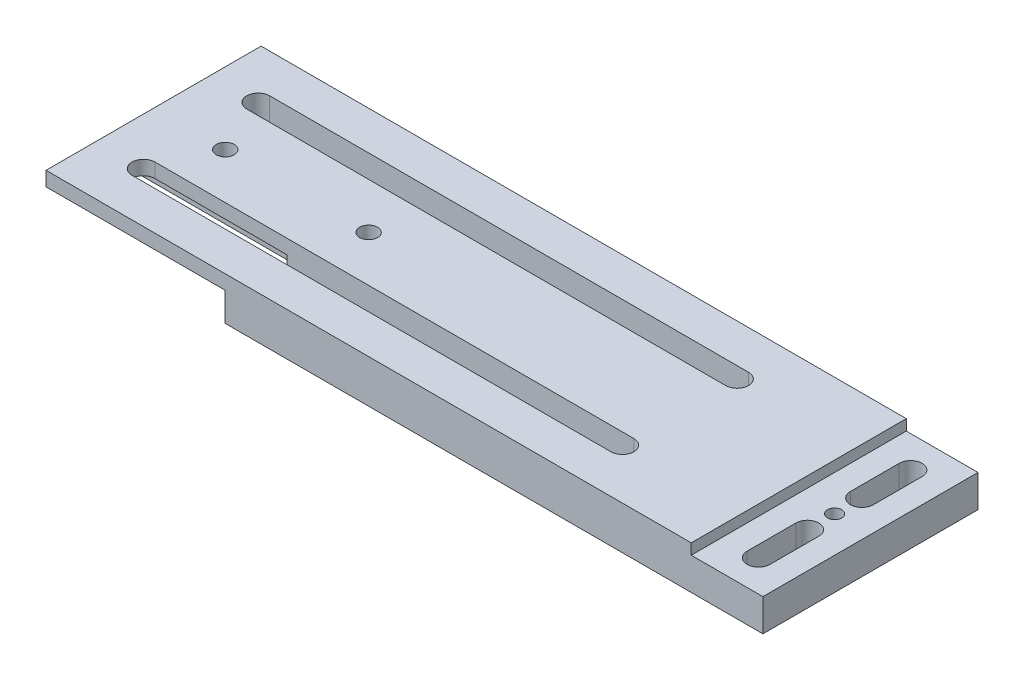
ISO-10303-21;
HEADER;
FILE_DESCRIPTION(('STEP AP214'),'2;1');
FILE_NAME('part.step','',(''),(''),'','','');
FILE_SCHEMA(('AUTOMOTIVE_DESIGN { 1 0 10303 214 1 1 1 1 }'));
ENDSEC;
DATA;
#1=APPLICATION_CONTEXT('core data for automotive mechanical design processes');
#2=APPLICATION_PROTOCOL_DEFINITION('international standard','automotive_design',2000,#1);
#3=PRODUCT_CONTEXT('',#1,'mechanical');
#4=PRODUCT('Part','Part','',(#3));
#5=PRODUCT_RELATED_PRODUCT_CATEGORY('part','',(#4));
#6=PRODUCT_DEFINITION_FORMATION('','',#4);
#7=PRODUCT_DEFINITION_CONTEXT('part definition',#1,'design');
#8=PRODUCT_DEFINITION('design','',#6,#7);
#9=PRODUCT_DEFINITION_SHAPE('','',#8);
#10=(LENGTH_UNIT() NAMED_UNIT(*) SI_UNIT(.MILLI.,.METRE.));
#11=(NAMED_UNIT(*) PLANE_ANGLE_UNIT() SI_UNIT($,.RADIAN.));
#12=(NAMED_UNIT(*) SI_UNIT($,.STERADIAN.) SOLID_ANGLE_UNIT());
#13=UNCERTAINTY_MEASURE_WITH_UNIT(LENGTH_MEASURE(1.E-05),#10,'distance_accuracy_value','');
#14=(GEOMETRIC_REPRESENTATION_CONTEXT(3) GLOBAL_UNCERTAINTY_ASSIGNED_CONTEXT((#13)) GLOBAL_UNIT_ASSIGNED_CONTEXT((#10,
#11,#12)) REPRESENTATION_CONTEXT('',''));
#15=CARTESIAN_POINT('',(0.,0.,0.));
#16=DIRECTION('',(0.,0.,1.));
#17=DIRECTION('',(1.,0.,0.));
#18=AXIS2_PLACEMENT_3D('',#15,#16,#17);
#19=CARTESIAN_POINT('',(50.,6.,-15.));
#20=DIRECTION('',(-1.,0.,0.));
#21=DIRECTION('',(0.,0.,1.));
#22=AXIS2_PLACEMENT_3D('',#19,#20,#21);
#23=PLANE('',#22);
#24=DIRECTION('',(0.,0.,-1.));
#25=VECTOR('',#24,1.);
#26=CARTESIAN_POINT('',(50.,4.5,15.));
#27=LINE('',#26,#25);
#28=CARTESIAN_POINT('',(50.,4.5,15.));
#29=VERTEX_POINT('',#28);
#30=CARTESIAN_POINT('',(50.,4.5,-15.));
#31=VERTEX_POINT('',#30);
#32=EDGE_CURVE('E345',#29,#31,#27,.T.);
#33=ORIENTED_EDGE('',*,*,#32,.F.);
#34=DIRECTION('',(0.,-1.,0.));
#35=VECTOR('',#34,1.);
#36=CARTESIAN_POINT('',(50.,6.,15.));
#37=LINE('',#36,#35);
#38=CARTESIAN_POINT('',(50.,0.,15.));
#39=VERTEX_POINT('',#38);
#40=EDGE_CURVE('E717',#29,#39,#37,.T.);
#41=ORIENTED_EDGE('',*,*,#40,.T.);
#42=DIRECTION('',(0.,0.,-1.));
#43=VECTOR('',#42,1.);
#44=CARTESIAN_POINT('',(50.,0.,-15.));
#45=LINE('',#44,#43);
#46=CARTESIAN_POINT('',(50.,0.,-15.));
#47=VERTEX_POINT('',#46);
#48=EDGE_CURVE('E709',#39,#47,#45,.T.);
#49=ORIENTED_EDGE('',*,*,#48,.T.);
#50=DIRECTION('',(0.,-1.,0.));
#51=VECTOR('',#50,1.);
#52=CARTESIAN_POINT('',(50.,6.,-15.));
#53=LINE('',#52,#51);
#54=EDGE_CURVE('E715',#31,#47,#53,.T.);
#55=ORIENTED_EDGE('',*,*,#54,.F.);
#56=EDGE_LOOP('',(#33,#41,#49,#55));
#57=FACE_BOUND('',#56,.T.);
#58=ADVANCED_FACE('F330',(#57),#23,.F.);
#59=CARTESIAN_POINT('',(45.,0.,-10.6050627929627));
#60=DIRECTION('',(0.,-1.,0.));
#61=DIRECTION('',(0.,0.,-1.));
#62=AXIS2_PLACEMENT_3D('',#59,#60,#61);
#63=CYLINDRICAL_SURFACE('',#62,1.6);
#64=CARTESIAN_POINT('',(45.,4.5,-10.6050627929627));
#65=DIRECTION('',(0.,1.,0.));
#66=DIRECTION('',(0.,0.,1.));
#67=AXIS2_PLACEMENT_3D('',#64,#65,#66);
#68=CIRCLE('',#67,1.6);
#69=CARTESIAN_POINT('',(43.4,4.5,-10.6050627929627));
#70=VERTEX_POINT('',#69);
#71=CARTESIAN_POINT('',(46.6,4.5,-10.6050627929627));
#72=VERTEX_POINT('',#71);
#73=EDGE_CURVE('E548',#70,#72,#68,.F.);
#74=ORIENTED_EDGE('',*,*,#73,.F.);
#75=DIRECTION('',(0.,-1.,0.));
#76=VECTOR('',#75,1.);
#77=CARTESIAN_POINT('',(43.4,0.,-10.6050627929627));
#78=LINE('',#77,#76);
#79=CARTESIAN_POINT('',(43.4,0.,-10.6050627929627));
#80=VERTEX_POINT('',#79);
#81=EDGE_CURVE('E633',#80,#70,#78,.F.);
#82=ORIENTED_EDGE('',*,*,#81,.F.);
#83=CARTESIAN_POINT('',(45.,0.,-10.6050627929627));
#84=DIRECTION('',(0.,-1.,0.));
#85=DIRECTION('',(0.,0.,-1.));
#86=AXIS2_PLACEMENT_3D('',#83,#84,#85);
#87=CIRCLE('',#86,1.6);
#88=CARTESIAN_POINT('',(46.6,0.,-10.6050627929627));
#89=VERTEX_POINT('',#88);
#90=EDGE_CURVE('E631',#80,#89,#87,.T.);
#91=ORIENTED_EDGE('',*,*,#90,.T.);
#92=DIRECTION('',(0.,1.,0.));
#93=VECTOR('',#92,1.);
#94=CARTESIAN_POINT('',(46.6,8.5,-10.6050627929627));
#95=LINE('',#94,#93);
#96=EDGE_CURVE('E628',#89,#72,#95,.T.);
#97=ORIENTED_EDGE('',*,*,#96,.T.);
#98=EDGE_LOOP('',(#74,#82,#91,#97));
#99=FACE_BOUND('',#98,.T.);
#100=ADVANCED_FACE('F841',(#99),#63,.F.);
#101=CARTESIAN_POINT('',(45.,0.,-3.80506279296271));
#102=DIRECTION('',(0.,-1.,0.));
#103=DIRECTION('',(0.,0.,-1.));
#104=AXIS2_PLACEMENT_3D('',#101,#102,#103);
#105=CYLINDRICAL_SURFACE('',#104,1.6);
#106=CARTESIAN_POINT('',(45.,4.5,-3.80506279296271));
#107=DIRECTION('',(0.,1.,0.));
#108=DIRECTION('',(0.,0.,1.));
#109=AXIS2_PLACEMENT_3D('',#106,#107,#108);
#110=CIRCLE('',#109,1.6);
#111=CARTESIAN_POINT('',(46.6,4.5,-3.80506279296271));
#112=VERTEX_POINT('',#111);
#113=CARTESIAN_POINT('',(43.4,4.5,-3.80506279296271));
#114=VERTEX_POINT('',#113);
#115=EDGE_CURVE('E353',#112,#114,#110,.F.);
#116=ORIENTED_EDGE('',*,*,#115,.F.);
#117=DIRECTION('',(0.,1.,0.));
#118=VECTOR('',#117,1.);
#119=CARTESIAN_POINT('',(46.6,8.5,-3.80506279296271));
#120=LINE('',#119,#118);
#121=CARTESIAN_POINT('',(46.6,0.,-3.80506279296271));
#122=VERTEX_POINT('',#121);
#123=EDGE_CURVE('E620',#122,#112,#120,.T.);
#124=ORIENTED_EDGE('',*,*,#123,.F.);
#125=CARTESIAN_POINT('',(45.,0.,-3.80506279296271));
#126=DIRECTION('',(0.,-1.,0.));
#127=DIRECTION('',(0.,0.,-1.));
#128=AXIS2_PLACEMENT_3D('',#125,#126,#127);
#129=CIRCLE('',#128,1.6);
#130=CARTESIAN_POINT('',(43.4,0.,-3.80506279296271));
#131=VERTEX_POINT('',#130);
#132=EDGE_CURVE('E623',#122,#131,#129,.T.);
#133=ORIENTED_EDGE('',*,*,#132,.T.);
#134=DIRECTION('',(0.,-1.,0.));
#135=VECTOR('',#134,1.);
#136=CARTESIAN_POINT('',(43.4,0.,-3.80506279296271));
#137=LINE('',#136,#135);
#138=EDGE_CURVE('E626',#114,#131,#137,.T.);
#139=ORIENTED_EDGE('',*,*,#138,.F.);
#140=EDGE_LOOP('',(#116,#124,#133,#139));
#141=FACE_BOUND('',#140,.T.);
#142=ADVANCED_FACE('F846',(#141),#105,.F.);
#143=CARTESIAN_POINT('',(46.6,8.5,-3.80506279296271));
#144=DIRECTION('',(-1.,0.,0.));
#145=DIRECTION('',(0.,-1.,0.));
#146=AXIS2_PLACEMENT_3D('',#143,#144,#145);
#147=PLANE('',#146);
#148=ORIENTED_EDGE('',*,*,#123,.T.);
#149=DIRECTION('',(0.,0.,-1.));
#150=VECTOR('',#149,1.);
#151=CARTESIAN_POINT('',(46.6,4.5,-3.80506279296271));
#152=LINE('',#151,#150);
#153=EDGE_CURVE('E550',#112,#72,#152,.T.);
#154=ORIENTED_EDGE('',*,*,#153,.T.);
#155=ORIENTED_EDGE('',*,*,#96,.F.);
#156=DIRECTION('',(0.,0.,-1.));
#157=VECTOR('',#156,1.);
#158=CARTESIAN_POINT('',(46.6,0.,-3.80506279296271));
#159=LINE('',#158,#157);
#160=EDGE_CURVE('E617',#122,#89,#159,.T.);
#161=ORIENTED_EDGE('',*,*,#160,.F.);
#162=EDGE_LOOP('',(#148,#154,#155,#161));
#163=FACE_BOUND('',#162,.T.);
#164=ADVANCED_FACE('F891',(#163),#147,.T.);
#165=CARTESIAN_POINT('',(43.4,0.,-3.80506279296271));
#166=DIRECTION('',(-1.,0.,0.));
#167=DIRECTION('',(0.,0.,1.));
#168=AXIS2_PLACEMENT_3D('',#165,#166,#167);
#169=PLANE('',#168);
#170=DIRECTION('',(0.,0.,-1.));
#171=VECTOR('',#170,1.);
#172=CARTESIAN_POINT('',(43.4,4.5,-3.80506279296271));
#173=LINE('',#172,#171);
#174=EDGE_CURVE('E545',#114,#70,#173,.T.);
#175=ORIENTED_EDGE('',*,*,#174,.F.);
#176=ORIENTED_EDGE('',*,*,#138,.T.);
#177=DIRECTION('',(0.,0.,-1.));
#178=VECTOR('',#177,1.);
#179=CARTESIAN_POINT('',(43.4,0.,-3.80506279296271));
#180=LINE('',#179,#178);
#181=EDGE_CURVE('E615',#131,#80,#180,.T.);
#182=ORIENTED_EDGE('',*,*,#181,.T.);
#183=ORIENTED_EDGE('',*,*,#81,.T.);
#184=EDGE_LOOP('',(#175,#176,#182,#183));
#185=FACE_BOUND('',#184,.T.);
#186=ADVANCED_FACE('F895',(#185),#169,.F.);
#187=CARTESIAN_POINT('',(45.,0.,3.80506279296273));
#188=DIRECTION('',(0.,-1.,0.));
#189=DIRECTION('',(0.,0.,-1.));
#190=AXIS2_PLACEMENT_3D('',#187,#188,#189);
#191=CYLINDRICAL_SURFACE('',#190,1.6);
#192=CARTESIAN_POINT('',(45.,4.5,3.80506279296273));
#193=DIRECTION('',(0.,1.,0.));
#194=DIRECTION('',(0.,0.,1.));
#195=AXIS2_PLACEMENT_3D('',#192,#193,#194);
#196=CIRCLE('',#195,1.6);
#197=CARTESIAN_POINT('',(43.4,4.5,3.80506279296273));
#198=VERTEX_POINT('',#197);
#199=CARTESIAN_POINT('',(46.6,4.5,3.80506279296273));
#200=VERTEX_POINT('',#199);
#201=EDGE_CURVE('E540',#198,#200,#196,.F.);
#202=ORIENTED_EDGE('',*,*,#201,.F.);
#203=DIRECTION('',(0.,-1.,0.));
#204=VECTOR('',#203,1.);
#205=CARTESIAN_POINT('',(43.4,0.,3.80506279296273));
#206=LINE('',#205,#204);
#207=CARTESIAN_POINT('',(43.4,0.,3.80506279296273));
#208=VERTEX_POINT('',#207);
#209=EDGE_CURVE('E612',#208,#198,#206,.F.);
#210=ORIENTED_EDGE('',*,*,#209,.F.);
#211=CARTESIAN_POINT('',(45.,0.,3.80506279296273));
#212=DIRECTION('',(0.,-1.,0.));
#213=DIRECTION('',(0.,0.,-1.));
#214=AXIS2_PLACEMENT_3D('',#211,#212,#213);
#215=CIRCLE('',#214,1.6);
#216=CARTESIAN_POINT('',(46.6,0.,3.80506279296273));
#217=VERTEX_POINT('',#216);
#218=EDGE_CURVE('E610',#208,#217,#215,.T.);
#219=ORIENTED_EDGE('',*,*,#218,.T.);
#220=DIRECTION('',(0.,1.,0.));
#221=VECTOR('',#220,1.);
#222=CARTESIAN_POINT('',(46.6,8.5,3.80506279296273));
#223=LINE('',#222,#221);
#224=EDGE_CURVE('E607',#217,#200,#223,.T.);
#225=ORIENTED_EDGE('',*,*,#224,.T.);
#226=EDGE_LOOP('',(#202,#210,#219,#225));
#227=FACE_BOUND('',#226,.T.);
#228=ADVANCED_FACE('F828',(#227),#191,.F.);
#229=CARTESIAN_POINT('',(45.,0.,10.6050627929627));
#230=DIRECTION('',(0.,-1.,0.));
#231=DIRECTION('',(0.,0.,-1.));
#232=AXIS2_PLACEMENT_3D('',#229,#230,#231);
#233=CYLINDRICAL_SURFACE('',#232,1.6);
#234=CARTESIAN_POINT('',(45.,4.5,10.6050627929627));
#235=DIRECTION('',(0.,1.,0.));
#236=DIRECTION('',(0.,0.,1.));
#237=AXIS2_PLACEMENT_3D('',#234,#235,#236);
#238=CIRCLE('',#237,1.6);
#239=CARTESIAN_POINT('',(46.6,4.5,10.6050627929627));
#240=VERTEX_POINT('',#239);
#241=CARTESIAN_POINT('',(43.4,4.5,10.6050627929627));
#242=VERTEX_POINT('',#241);
#243=EDGE_CURVE('E534',#240,#242,#238,.F.);
#244=ORIENTED_EDGE('',*,*,#243,.F.);
#245=DIRECTION('',(0.,1.,0.));
#246=VECTOR('',#245,1.);
#247=CARTESIAN_POINT('',(46.6,8.5,10.6050627929627));
#248=LINE('',#247,#246);
#249=CARTESIAN_POINT('',(46.6,0.,10.6050627929627));
#250=VERTEX_POINT('',#249);
#251=EDGE_CURVE('E599',#250,#240,#248,.T.);
#252=ORIENTED_EDGE('',*,*,#251,.F.);
#253=CARTESIAN_POINT('',(45.,0.,10.6050627929627));
#254=DIRECTION('',(0.,-1.,0.));
#255=DIRECTION('',(0.,0.,-1.));
#256=AXIS2_PLACEMENT_3D('',#253,#254,#255);
#257=CIRCLE('',#256,1.6);
#258=CARTESIAN_POINT('',(43.4,0.,10.6050627929627));
#259=VERTEX_POINT('',#258);
#260=EDGE_CURVE('E602',#250,#259,#257,.T.);
#261=ORIENTED_EDGE('',*,*,#260,.T.);
#262=DIRECTION('',(0.,-1.,0.));
#263=VECTOR('',#262,1.);
#264=CARTESIAN_POINT('',(43.4,0.,10.6050627929627));
#265=LINE('',#264,#263);
#266=EDGE_CURVE('E605',#242,#259,#265,.T.);
#267=ORIENTED_EDGE('',*,*,#266,.F.);
#268=EDGE_LOOP('',(#244,#252,#261,#267));
#269=FACE_BOUND('',#268,.T.);
#270=ADVANCED_FACE('F821',(#269),#233,.F.);
#271=CARTESIAN_POINT('',(46.6,8.5,10.6050627929627));
#272=DIRECTION('',(-1.,0.,0.));
#273=DIRECTION('',(0.,-1.,0.));
#274=AXIS2_PLACEMENT_3D('',#271,#272,#273);
#275=PLANE('',#274);
#276=ORIENTED_EDGE('',*,*,#251,.T.);
#277=DIRECTION('',(0.,0.,-1.));
#278=VECTOR('',#277,1.);
#279=CARTESIAN_POINT('',(46.6,4.5,10.6050627929627));
#280=LINE('',#279,#278);
#281=EDGE_CURVE('E542',#240,#200,#280,.T.);
#282=ORIENTED_EDGE('',*,*,#281,.T.);
#283=ORIENTED_EDGE('',*,*,#224,.F.);
#284=DIRECTION('',(0.,0.,-1.));
#285=VECTOR('',#284,1.);
#286=CARTESIAN_POINT('',(46.6,0.,10.6050627929627));
#287=LINE('',#286,#285);
#288=EDGE_CURVE('E596',#250,#217,#287,.T.);
#289=ORIENTED_EDGE('',*,*,#288,.F.);
#290=EDGE_LOOP('',(#276,#282,#283,#289));
#291=FACE_BOUND('',#290,.T.);
#292=ADVANCED_FACE('F831',(#291),#275,.T.);
#293=CARTESIAN_POINT('',(43.4,0.,10.6050627929627));
#294=DIRECTION('',(-1.,0.,0.));
#295=DIRECTION('',(0.,0.,1.));
#296=AXIS2_PLACEMENT_3D('',#293,#294,#295);
#297=PLANE('',#296);
#298=DIRECTION('',(0.,0.,-1.));
#299=VECTOR('',#298,1.);
#300=CARTESIAN_POINT('',(43.4,4.5,10.6050627929627));
#301=LINE('',#300,#299);
#302=EDGE_CURVE('E13',#242,#198,#301,.T.);
#303=ORIENTED_EDGE('',*,*,#302,.F.);
#304=ORIENTED_EDGE('',*,*,#266,.T.);
#305=DIRECTION('',(0.,0.,-1.));
#306=VECTOR('',#305,1.);
#307=CARTESIAN_POINT('',(43.4,0.,10.6050627929627));
#308=LINE('',#307,#306);
#309=EDGE_CURVE('E594',#259,#208,#308,.T.);
#310=ORIENTED_EDGE('',*,*,#309,.T.);
#311=ORIENTED_EDGE('',*,*,#209,.T.);
#312=EDGE_LOOP('',(#303,#304,#310,#311));
#313=FACE_BOUND('',#312,.T.);
#314=ADVANCED_FACE('F819',(#313),#297,.F.);
#315=CARTESIAN_POINT('',(0.,6.,0.));
#316=DIRECTION('',(0.,1.,0.));
#317=DIRECTION('',(0.,0.,1.));
#318=AXIS2_PLACEMENT_3D('',#315,#316,#317);
#319=PLANE('',#318);
#320=DIRECTION('',(0.,0.,1.));
#321=VECTOR('',#320,1.);
#322=CARTESIAN_POINT('',(40.,6.,15.));
#323=LINE('',#322,#321);
#324=CARTESIAN_POINT('',(40.,6.,-15.));
#325=VERTEX_POINT('',#324);
#326=CARTESIAN_POINT('',(40.,6.,15.));
#327=VERTEX_POINT('',#326);
#328=EDGE_CURVE('E796',#325,#327,#323,.T.);
#329=ORIENTED_EDGE('',*,*,#328,.F.);
#330=DIRECTION('',(-1.,0.,0.));
#331=VECTOR('',#330,1.);
#332=CARTESIAN_POINT('',(-50.,6.,-15.));
#333=LINE('',#332,#331);
#334=CARTESIAN_POINT('',(-50.,6.,-15.));
#335=VERTEX_POINT('',#334);
#336=EDGE_CURVE('E532',#325,#335,#333,.T.);
#337=ORIENTED_EDGE('',*,*,#336,.T.);
#338=DIRECTION('',(0.,0.,1.));
#339=VECTOR('',#338,1.);
#340=CARTESIAN_POINT('',(-50.,6.,-15.));
#341=LINE('',#340,#339);
#342=CARTESIAN_POINT('',(-50.,6.,15.));
#343=VERTEX_POINT('',#342);
#344=EDGE_CURVE('E695',#335,#343,#341,.T.);
#345=ORIENTED_EDGE('',*,*,#344,.T.);
#346=DIRECTION('',(1.,0.,0.));
#347=VECTOR('',#346,1.);
#348=CARTESIAN_POINT('',(-50.,6.,15.));
#349=LINE('',#348,#347);
#350=EDGE_CURVE('E698',#343,#327,#349,.T.);
#351=ORIENTED_EDGE('',*,*,#350,.T.);
#352=EDGE_LOOP('',(#329,#337,#345,#351));
#353=FACE_BOUND('',#352,.T.);
#354=CARTESIAN_POINT('',(-40.,6.,0.));
#355=DIRECTION('',(0.,1.,0.));
#356=DIRECTION('',(0.,0.,1.));
#357=AXIS2_PLACEMENT_3D('',#354,#355,#356);
#358=CIRCLE('',#357,1.24999999999999);
#359=CARTESIAN_POINT('',(-40.,6.,1.24999999999999));
#360=VERTEX_POINT('',#359);
#361=EDGE_CURVE('E582',#360,#360,#358,.T.);
#362=ORIENTED_EDGE('',*,*,#361,.F.);
#363=EDGE_LOOP('',(#362));
#364=FACE_BOUND('',#363,.T.);
#365=CARTESIAN_POINT('',(-20.,6.,0.));
#366=DIRECTION('',(0.,1.,0.));
#367=DIRECTION('',(0.,0.,1.));
#368=AXIS2_PLACEMENT_3D('',#365,#366,#367);
#369=CIRCLE('',#368,1.24999999999999);
#370=CARTESIAN_POINT('',(-20.,6.,1.24999999999999));
#371=VERTEX_POINT('',#370);
#372=EDGE_CURVE('E588',#371,#371,#369,.T.);
#373=ORIENTED_EDGE('',*,*,#372,.F.);
#374=EDGE_LOOP('',(#373));
#375=FACE_BOUND('',#374,.T.);
#376=CARTESIAN_POINT('',(-43.4,6.,8.00000000000001));
#377=DIRECTION('',(0.,1.,0.));
#378=DIRECTION('',(0.,0.,1.));
#379=AXIS2_PLACEMENT_3D('',#376,#377,#378);
#380=CIRCLE('',#379,1.6);
#381=CARTESIAN_POINT('',(-43.4,6.,6.40000000000001));
#382=VERTEX_POINT('',#381);
#383=CARTESIAN_POINT('',(-43.4,6.,9.6));
#384=VERTEX_POINT('',#383);
#385=EDGE_CURVE('E675',#382,#384,#380,.T.);
#386=ORIENTED_EDGE('',*,*,#385,.F.);
#387=DIRECTION('',(1.,0.,0.));
#388=VECTOR('',#387,1.);
#389=CARTESIAN_POINT('',(-43.4,6.,6.40000000000001));
#390=LINE('',#389,#388);
#391=CARTESIAN_POINT('',(23.4,6.,6.4));
#392=VERTEX_POINT('',#391);
#393=EDGE_CURVE('E672',#382,#392,#390,.T.);
#394=ORIENTED_EDGE('',*,*,#393,.T.);
#395=CARTESIAN_POINT('',(23.4,6.,7.99999999999999));
#396=DIRECTION('',(0.,1.,0.));
#397=DIRECTION('',(0.,0.,1.));
#398=AXIS2_PLACEMENT_3D('',#395,#396,#397);
#399=CIRCLE('',#398,1.6);
#400=CARTESIAN_POINT('',(23.4,6.,9.60000000000007));
#401=VERTEX_POINT('',#400);
#402=EDGE_CURVE('E683',#401,#392,#399,.T.);
#403=ORIENTED_EDGE('',*,*,#402,.F.);
#404=DIRECTION('',(1.,0.,0.));
#405=VECTOR('',#404,1.);
#406=CARTESIAN_POINT('',(-43.4,6.,9.60000000000008));
#407=LINE('',#406,#405);
#408=EDGE_CURVE('E666',#384,#401,#407,.T.);
#409=ORIENTED_EDGE('',*,*,#408,.F.);
#410=EDGE_LOOP('',(#386,#394,#403,#409));
#411=FACE_BOUND('',#410,.T.);
#412=CARTESIAN_POINT('',(-43.4,6.,-7.99999999999999));
#413=DIRECTION('',(0.,1.,0.));
#414=DIRECTION('',(0.,0.,1.));
#415=AXIS2_PLACEMENT_3D('',#412,#413,#414);
#416=CIRCLE('',#415,1.6);
#417=CARTESIAN_POINT('',(-43.4,6.,-9.59999999999999));
#418=VERTEX_POINT('',#417);
#419=CARTESIAN_POINT('',(-43.4,6.,-6.4));
#420=VERTEX_POINT('',#419);
#421=EDGE_CURVE('E646',#418,#420,#416,.T.);
#422=ORIENTED_EDGE('',*,*,#421,.F.);
#423=DIRECTION('',(1.,0.,0.));
#424=VECTOR('',#423,1.);
#425=CARTESIAN_POINT('',(-43.4,6.,-9.59999999999999));
#426=LINE('',#425,#424);
#427=CARTESIAN_POINT('',(23.4,6.,-9.6));
#428=VERTEX_POINT('',#427);
#429=EDGE_CURVE('E643',#418,#428,#426,.T.);
#430=ORIENTED_EDGE('',*,*,#429,.T.);
#431=CARTESIAN_POINT('',(23.4,6.,-8.00000000000001));
#432=DIRECTION('',(0.,1.,0.));
#433=DIRECTION('',(0.,0.,1.));
#434=AXIS2_PLACEMENT_3D('',#431,#432,#433);
#435=CIRCLE('',#434,1.6);
#436=CARTESIAN_POINT('',(23.4,6.,-6.39999999999996));
#437=VERTEX_POINT('',#436);
#438=EDGE_CURVE('E656',#437,#428,#435,.T.);
#439=ORIENTED_EDGE('',*,*,#438,.F.);
#440=DIRECTION('',(1.,0.,0.));
#441=VECTOR('',#440,1.);
#442=CARTESIAN_POINT('',(-43.4,6.,-6.39999999999995));
#443=LINE('',#442,#441);
#444=EDGE_CURVE('E636',#420,#437,#443,.T.);
#445=ORIENTED_EDGE('',*,*,#444,.F.);
#446=EDGE_LOOP('',(#422,#430,#439,#445));
#447=FACE_BOUND('',#446,.T.);
#448=ADVANCED_FACE('F772',(#353,#364,#375,#411,#447),#319,.T.);
#449=CARTESIAN_POINT('',(0.,0.,0.));
#450=DIRECTION('',(0.,1.,0.));
#451=DIRECTION('',(0.,0.,1.));
#452=AXIS2_PLACEMENT_3D('',#449,#450,#451);
#453=PLANE('',#452);
#454=CARTESIAN_POINT('',(45.,0.,0.));
#455=DIRECTION('',(0.,1.,0.));
#456=DIRECTION('',(0.,0.,1.));
#457=AXIS2_PLACEMENT_3D('',#454,#455,#456);
#458=CIRCLE('',#457,0.999999999999987);
#459=CARTESIAN_POINT('',(45.,0.,0.999999999999998));
#460=VERTEX_POINT('',#459);
#461=EDGE_CURVE('E797',#460,#460,#458,.T.);
#462=ORIENTED_EDGE('',*,*,#461,.T.);
#463=EDGE_LOOP('',(#462));
#464=FACE_BOUND('',#463,.T.);
#465=CARTESIAN_POINT('',(-40.,0.,0.));
#466=DIRECTION('',(0.,1.,0.));
#467=DIRECTION('',(0.,0.,1.));
#468=AXIS2_PLACEMENT_3D('',#465,#466,#467);
#469=CIRCLE('',#468,1.24999999999999);
#470=CARTESIAN_POINT('',(-40.,0.,1.24999999999999));
#471=VERTEX_POINT('',#470);
#472=EDGE_CURVE('E585',#471,#471,#469,.T.);
#473=ORIENTED_EDGE('',*,*,#472,.T.);
#474=EDGE_LOOP('',(#473));
#475=FACE_BOUND('',#474,.T.);
#476=CARTESIAN_POINT('',(-20.,0.,0.));
#477=DIRECTION('',(0.,1.,0.));
#478=DIRECTION('',(0.,0.,1.));
#479=AXIS2_PLACEMENT_3D('',#476,#477,#478);
#480=CIRCLE('',#479,1.24999999999999);
#481=CARTESIAN_POINT('',(-20.,0.,1.24999999999999));
#482=VERTEX_POINT('',#481);
#483=EDGE_CURVE('E591',#482,#482,#480,.T.);
#484=ORIENTED_EDGE('',*,*,#483,.T.);
#485=EDGE_LOOP('',(#484));
#486=FACE_BOUND('',#485,.T.);
#487=ORIENTED_EDGE('',*,*,#260,.F.);
#488=ORIENTED_EDGE('',*,*,#288,.T.);
#489=ORIENTED_EDGE('',*,*,#218,.F.);
#490=ORIENTED_EDGE('',*,*,#309,.F.);
#491=EDGE_LOOP('',(#487,#488,#489,#490));
#492=FACE_BOUND('',#491,.T.);
#493=ORIENTED_EDGE('',*,*,#160,.T.);
#494=ORIENTED_EDGE('',*,*,#90,.F.);
#495=ORIENTED_EDGE('',*,*,#181,.F.);
#496=ORIENTED_EDGE('',*,*,#132,.F.);
#497=EDGE_LOOP('',(#493,#494,#495,#496));
#498=FACE_BOUND('',#497,.T.);
#499=DIRECTION('',(0.,0.,1.));
#500=VECTOR('',#499,1.);
#501=CARTESIAN_POINT('',(-25.,0.,15.));
#502=LINE('',#501,#500);
#503=CARTESIAN_POINT('',(-25.,0.,5.5));
#504=VERTEX_POINT('',#503);
#505=CARTESIAN_POINT('',(-25.,0.,6.4));
#506=VERTEX_POINT('',#505);
#507=EDGE_CURVE('E562',#504,#506,#502,.T.);
#508=ORIENTED_EDGE('',*,*,#507,.F.);
#509=CARTESIAN_POINT('',(-27.5,0.,5.5));
#510=DIRECTION('',(0.,1.,0.));
#511=DIRECTION('',(0.,0.,1.));
#512=AXIS2_PLACEMENT_3D('',#509,#510,#511);
#513=CIRCLE('',#512,2.5);
#514=CARTESIAN_POINT('',(-27.5,0.,3.));
#515=VERTEX_POINT('',#514);
#516=EDGE_CURVE('E338',#504,#515,#513,.T.);
#517=ORIENTED_EDGE('',*,*,#516,.T.);
#518=DIRECTION('',(-1.,0.,0.));
#519=VECTOR('',#518,1.);
#520=CARTESIAN_POINT('',(-25.,0.,3.));
#521=LINE('',#520,#519);
#522=CARTESIAN_POINT('',(-50.,0.,3.));
#523=VERTEX_POINT('',#522);
#524=EDGE_CURVE('E569',#515,#523,#521,.T.);
#525=ORIENTED_EDGE('',*,*,#524,.T.);
#526=DIRECTION('',(0.,0.,1.));
#527=VECTOR('',#526,1.);
#528=CARTESIAN_POINT('',(-50.,0.,-15.));
#529=LINE('',#528,#527);
#530=CARTESIAN_POINT('',(-50.,0.,-15.));
#531=VERTEX_POINT('',#530);
#532=EDGE_CURVE('E694',#531,#523,#529,.T.);
#533=ORIENTED_EDGE('',*,*,#532,.F.);
#534=DIRECTION('',(-1.,0.,0.));
#535=VECTOR('',#534,1.);
#536=CARTESIAN_POINT('',(-50.,0.,-15.));
#537=LINE('',#536,#535);
#538=EDGE_CURVE('E699',#47,#531,#537,.T.);
#539=ORIENTED_EDGE('',*,*,#538,.F.);
#540=ORIENTED_EDGE('',*,*,#48,.F.);
#541=DIRECTION('',(1.,0.,0.));
#542=VECTOR('',#541,1.);
#543=CARTESIAN_POINT('',(-50.,0.,15.));
#544=LINE('',#543,#542);
#545=CARTESIAN_POINT('',(-25.,0.,15.));
#546=VERTEX_POINT('',#545);
#547=EDGE_CURVE('E706',#546,#39,#544,.T.);
#548=ORIENTED_EDGE('',*,*,#547,.F.);
#549=CARTESIAN_POINT('',(-25.,0.,9.6));
#550=VERTEX_POINT('',#549);
#551=EDGE_CURVE('E561',#550,#546,#502,.T.);
#552=ORIENTED_EDGE('',*,*,#551,.F.);
#553=DIRECTION('',(1.,0.,0.));
#554=VECTOR('',#553,1.);
#555=CARTESIAN_POINT('',(-43.4,0.,9.6));
#556=LINE('',#555,#554);
#557=CARTESIAN_POINT('',(23.4,0.,9.59999999999999));
#558=VERTEX_POINT('',#557);
#559=EDGE_CURVE('E668',#550,#558,#556,.T.);
#560=ORIENTED_EDGE('',*,*,#559,.T.);
#561=CARTESIAN_POINT('',(23.4,0.,7.99999999999999));
#562=DIRECTION('',(0.,1.,0.));
#563=DIRECTION('',(0.,0.,1.));
#564=AXIS2_PLACEMENT_3D('',#561,#562,#563);
#565=CIRCLE('',#564,1.6);
#566=CARTESIAN_POINT('',(23.4,0.,6.4));
#567=VERTEX_POINT('',#566);
#568=EDGE_CURVE('E686',#558,#567,#565,.T.);
#569=ORIENTED_EDGE('',*,*,#568,.T.);
#570=DIRECTION('',(1.,0.,0.));
#571=VECTOR('',#570,1.);
#572=CARTESIAN_POINT('',(-43.4,0.,6.40000000000001));
#573=LINE('',#572,#571);
#574=EDGE_CURVE('E670',#506,#567,#573,.T.);
#575=ORIENTED_EDGE('',*,*,#574,.F.);
#576=EDGE_LOOP('',(#508,#517,#525,#533,#539,#540,#548,#552,#560,#569,#575));
#577=FACE_BOUND('',#576,.T.);
#578=DIRECTION('',(1.,0.,0.));
#579=VECTOR('',#578,1.);
#580=CARTESIAN_POINT('',(-43.4,0.,-9.59999999999999));
#581=LINE('',#580,#579);
#582=CARTESIAN_POINT('',(-43.4,0.,-9.59999999999999));
#583=VERTEX_POINT('',#582);
#584=CARTESIAN_POINT('',(23.4,0.,-9.6));
#585=VERTEX_POINT('',#584);
#586=EDGE_CURVE('E641',#583,#585,#581,.T.);
#587=ORIENTED_EDGE('',*,*,#586,.F.);
#588=CARTESIAN_POINT('',(-43.4,0.,-7.99999999999999));
#589=DIRECTION('',(0.,1.,0.));
#590=DIRECTION('',(0.,0.,1.));
#591=AXIS2_PLACEMENT_3D('',#588,#589,#590);
#592=CIRCLE('',#591,1.6);
#593=CARTESIAN_POINT('',(-43.4,0.,-6.4));
#594=VERTEX_POINT('',#593);
#595=EDGE_CURVE('E648',#583,#594,#592,.T.);
#596=ORIENTED_EDGE('',*,*,#595,.T.);
#597=DIRECTION('',(1.,0.,0.));
#598=VECTOR('',#597,1.);
#599=CARTESIAN_POINT('',(-43.4,0.,-6.4));
#600=LINE('',#599,#598);
#601=CARTESIAN_POINT('',(23.4,0.,-6.40000000000001));
#602=VERTEX_POINT('',#601);
#603=EDGE_CURVE('E638',#594,#602,#600,.T.);
#604=ORIENTED_EDGE('',*,*,#603,.T.);
#605=CARTESIAN_POINT('',(23.4,0.,-8.00000000000001));
#606=DIRECTION('',(0.,1.,0.));
#607=DIRECTION('',(0.,0.,1.));
#608=AXIS2_PLACEMENT_3D('',#605,#606,#607);
#609=CIRCLE('',#608,1.6);
#610=EDGE_CURVE('E659',#602,#585,#609,.T.);
#611=ORIENTED_EDGE('',*,*,#610,.T.);
#612=EDGE_LOOP('',(#587,#596,#604,#611));
#613=FACE_BOUND('',#612,.T.);
#614=ADVANCED_FACE('F736',(#464,#475,#486,#492,#498,#577,#613),#453,.F.);
#615=CARTESIAN_POINT('',(-50.,6.,-15.));
#616=DIRECTION('',(1.,0.,0.));
#617=DIRECTION('',(0.,0.,-1.));
#618=AXIS2_PLACEMENT_3D('',#615,#616,#617);
#619=PLANE('',#618);
#620=ORIENTED_EDGE('',*,*,#532,.T.);
#621=DIRECTION('',(0.,-1.,0.));
#622=VECTOR('',#621,1.);
#623=CARTESIAN_POINT('',(-50.,0.,3.));
#624=LINE('',#623,#622);
#625=CARTESIAN_POINT('',(-50.,4.,3.));
#626=VERTEX_POINT('',#625);
#627=EDGE_CURVE('E558',#626,#523,#624,.T.);
#628=ORIENTED_EDGE('',*,*,#627,.F.);
#629=DIRECTION('',(0.,0.,-1.));
#630=VECTOR('',#629,1.);
#631=CARTESIAN_POINT('',(-50.,4.,15.));
#632=LINE('',#631,#630);
#633=CARTESIAN_POINT('',(-50.,4.,15.));
#634=VERTEX_POINT('',#633);
#635=EDGE_CURVE('E553',#634,#626,#632,.T.);
#636=ORIENTED_EDGE('',*,*,#635,.F.);
#637=DIRECTION('',(0.,-1.,0.));
#638=VECTOR('',#637,1.);
#639=CARTESIAN_POINT('',(-50.,6.,15.));
#640=LINE('',#639,#638);
#641=EDGE_CURVE('E719',#343,#634,#640,.T.);
#642=ORIENTED_EDGE('',*,*,#641,.F.);
#643=ORIENTED_EDGE('',*,*,#344,.F.);
#644=DIRECTION('',(0.,-1.,0.));
#645=VECTOR('',#644,1.);
#646=CARTESIAN_POINT('',(-50.,6.,-15.));
#647=LINE('',#646,#645);
#648=EDGE_CURVE('E703',#335,#531,#647,.T.);
#649=ORIENTED_EDGE('',*,*,#648,.T.);
#650=EDGE_LOOP('',(#620,#628,#636,#642,#643,#649));
#651=FACE_BOUND('',#650,.T.);
#652=ADVANCED_FACE('F789',(#651),#619,.F.);
#653=CARTESIAN_POINT('',(-50.,6.,15.));
#654=DIRECTION('',(0.,0.,-1.));
#655=DIRECTION('',(-1.,0.,0.));
#656=AXIS2_PLACEMENT_3D('',#653,#654,#655);
#657=PLANE('',#656);
#658=DIRECTION('',(1.,0.,0.));
#659=VECTOR('',#658,1.);
#660=CARTESIAN_POINT('',(50.,4.5,15.));
#661=LINE('',#660,#659);
#662=CARTESIAN_POINT('',(40.,4.5,15.));
#663=VERTEX_POINT('',#662);
#664=EDGE_CURVE('E522',#663,#29,#661,.T.);
#665=ORIENTED_EDGE('',*,*,#664,.F.);
#666=DIRECTION('',(0.,1.,0.));
#667=VECTOR('',#666,1.);
#668=CARTESIAN_POINT('',(40.,4.5,15.));
#669=LINE('',#668,#667);
#670=EDGE_CURVE('E520',#663,#327,#669,.T.);
#671=ORIENTED_EDGE('',*,*,#670,.T.);
#672=ORIENTED_EDGE('',*,*,#350,.F.);
#673=ORIENTED_EDGE('',*,*,#641,.T.);
#674=DIRECTION('',(-1.,0.,0.));
#675=VECTOR('',#674,1.);
#676=CARTESIAN_POINT('',(-25.,4.,15.));
#677=LINE('',#676,#675);
#678=CARTESIAN_POINT('',(-25.,4.,15.));
#679=VERTEX_POINT('',#678);
#680=EDGE_CURVE('E564',#679,#634,#677,.T.);
#681=ORIENTED_EDGE('',*,*,#680,.F.);
#682=DIRECTION('',(0.,1.,0.));
#683=VECTOR('',#682,1.);
#684=CARTESIAN_POINT('',(-25.,0.,15.));
#685=LINE('',#684,#683);
#686=EDGE_CURVE('E554',#546,#679,#685,.T.);
#687=ORIENTED_EDGE('',*,*,#686,.F.);
#688=ORIENTED_EDGE('',*,*,#547,.T.);
#689=ORIENTED_EDGE('',*,*,#40,.F.);
#690=EDGE_LOOP('',(#665,#671,#672,#673,#681,#687,#688,#689));
#691=FACE_BOUND('',#690,.T.);
#692=ADVANCED_FACE('F785',(#691),#657,.F.);
#693=CARTESIAN_POINT('',(-50.,6.,-15.));
#694=DIRECTION('',(0.,0.,1.));
#695=DIRECTION('',(1.,0.,0.));
#696=AXIS2_PLACEMENT_3D('',#693,#694,#695);
#697=PLANE('',#696);
#698=ORIENTED_EDGE('',*,*,#336,.F.);
#699=DIRECTION('',(0.,1.,0.));
#700=VECTOR('',#699,1.);
#701=CARTESIAN_POINT('',(40.,4.5,-15.));
#702=LINE('',#701,#700);
#703=CARTESIAN_POINT('',(40.,4.5,-15.));
#704=VERTEX_POINT('',#703);
#705=EDGE_CURVE('E517',#704,#325,#702,.T.);
#706=ORIENTED_EDGE('',*,*,#705,.F.);
#707=DIRECTION('',(-1.,0.,0.));
#708=VECTOR('',#707,1.);
#709=CARTESIAN_POINT('',(50.,4.5,-15.));
#710=LINE('',#709,#708);
#711=EDGE_CURVE('E523',#31,#704,#710,.T.);
#712=ORIENTED_EDGE('',*,*,#711,.F.);
#713=ORIENTED_EDGE('',*,*,#54,.T.);
#714=ORIENTED_EDGE('',*,*,#538,.T.);
#715=ORIENTED_EDGE('',*,*,#648,.F.);
#716=EDGE_LOOP('',(#698,#706,#712,#713,#714,#715));
#717=FACE_BOUND('',#716,.T.);
#718=ADVANCED_FACE('F530',(#717),#697,.F.);
#719=CARTESIAN_POINT('',(23.4,6.,7.99999999999999));
#720=DIRECTION('',(0.,1.,0.));
#721=DIRECTION('',(0.,0.,1.));
#722=AXIS2_PLACEMENT_3D('',#719,#720,#721);
#723=CYLINDRICAL_SURFACE('',#722,1.6);
#724=ORIENTED_EDGE('',*,*,#568,.F.);
#725=DIRECTION('',(0.,1.,0.));
#726=VECTOR('',#725,1.);
#727=CARTESIAN_POINT('',(23.4,6.,9.59999999999999));
#728=LINE('',#727,#726);
#729=EDGE_CURVE('E691',#401,#558,#728,.F.);
#730=ORIENTED_EDGE('',*,*,#729,.F.);
#731=ORIENTED_EDGE('',*,*,#402,.T.);
#732=DIRECTION('',(0.,1.,0.));
#733=VECTOR('',#732,1.);
#734=CARTESIAN_POINT('',(23.4,6.,6.4));
#735=LINE('',#734,#733);
#736=EDGE_CURVE('E689',#567,#392,#735,.T.);
#737=ORIENTED_EDGE('',*,*,#736,.F.);
#738=EDGE_LOOP('',(#724,#730,#731,#737));
#739=FACE_BOUND('',#738,.T.);
#740=ADVANCED_FACE('F763',(#739),#723,.F.);
#741=CARTESIAN_POINT('',(-43.4,6.,8.00000000000001));
#742=DIRECTION('',(0.,1.,0.));
#743=DIRECTION('',(0.,0.,1.));
#744=AXIS2_PLACEMENT_3D('',#741,#742,#743);
#745=CYLINDRICAL_SURFACE('',#744,1.6);
#746=DIRECTION('',(0.,1.,0.));
#747=VECTOR('',#746,1.);
#748=CARTESIAN_POINT('',(-43.4,6.,9.6));
#749=LINE('',#748,#747);
#750=CARTESIAN_POINT('',(-43.4,4.,9.6));
#751=VERTEX_POINT('',#750);
#752=EDGE_CURVE('E678',#751,#384,#749,.T.);
#753=ORIENTED_EDGE('',*,*,#752,.F.);
#754=CARTESIAN_POINT('',(-43.4,4.,8.00000000000001));
#755=DIRECTION('',(0.,1.,0.));
#756=DIRECTION('',(0.,0.,1.));
#757=AXIS2_PLACEMENT_3D('',#754,#755,#756);
#758=CIRCLE('',#757,1.6);
#759=CARTESIAN_POINT('',(-43.4,4.,6.40000000000001));
#760=VERTEX_POINT('',#759);
#761=EDGE_CURVE('E576',#751,#760,#758,.F.);
#762=ORIENTED_EDGE('',*,*,#761,.T.);
#763=DIRECTION('',(0.,1.,0.));
#764=VECTOR('',#763,1.);
#765=CARTESIAN_POINT('',(-43.4,6.,6.40000000000001));
#766=LINE('',#765,#764);
#767=EDGE_CURVE('E680',#382,#760,#766,.F.);
#768=ORIENTED_EDGE('',*,*,#767,.F.);
#769=ORIENTED_EDGE('',*,*,#385,.T.);
#770=EDGE_LOOP('',(#753,#762,#768,#769));
#771=FACE_BOUND('',#770,.T.);
#772=ADVANCED_FACE('F770',(#771),#745,.F.);
#773=CARTESIAN_POINT('',(-43.4,6.,6.40000000000001));
#774=DIRECTION('',(0.,0.,-1.));
#775=DIRECTION('',(-1.,0.,0.));
#776=AXIS2_PLACEMENT_3D('',#773,#774,#775);
#777=PLANE('',#776);
#778=ORIENTED_EDGE('',*,*,#767,.T.);
#779=DIRECTION('',(1.,0.,0.));
#780=VECTOR('',#779,1.);
#781=CARTESIAN_POINT('',(-43.4,4.,6.40000000000001));
#782=LINE('',#781,#780);
#783=CARTESIAN_POINT('',(-25.,4.,6.4));
#784=VERTEX_POINT('',#783);
#785=EDGE_CURVE('E579',#760,#784,#782,.T.);
#786=ORIENTED_EDGE('',*,*,#785,.T.);
#787=DIRECTION('',(0.,1.,0.));
#788=VECTOR('',#787,1.);
#789=CARTESIAN_POINT('',(-25.,6.,6.4));
#790=LINE('',#789,#788);
#791=EDGE_CURVE('E571',#506,#784,#790,.T.);
#792=ORIENTED_EDGE('',*,*,#791,.F.);
#793=ORIENTED_EDGE('',*,*,#574,.T.);
#794=ORIENTED_EDGE('',*,*,#736,.T.);
#795=ORIENTED_EDGE('',*,*,#393,.F.);
#796=EDGE_LOOP('',(#778,#786,#792,#793,#794,#795));
#797=FACE_BOUND('',#796,.T.);
#798=ADVANCED_FACE('F756',(#797),#777,.F.);
#799=CARTESIAN_POINT('',(-43.4,6.,9.6));
#800=DIRECTION('',(0.,0.,1.));
#801=DIRECTION('',(1.,0.,0.));
#802=AXIS2_PLACEMENT_3D('',#799,#800,#801);
#803=PLANE('',#802);
#804=DIRECTION('',(0.,-1.,0.));
#805=VECTOR('',#804,1.);
#806=CARTESIAN_POINT('',(-25.,6.,9.6));
#807=LINE('',#806,#805);
#808=CARTESIAN_POINT('',(-25.,4.,9.6));
#809=VERTEX_POINT('',#808);
#810=EDGE_CURVE('E722',#809,#550,#807,.T.);
#811=ORIENTED_EDGE('',*,*,#810,.F.);
#812=DIRECTION('',(-1.,0.,0.));
#813=VECTOR('',#812,1.);
#814=CARTESIAN_POINT('',(-43.4,4.,9.6));
#815=LINE('',#814,#813);
#816=EDGE_CURVE('E724',#809,#751,#815,.T.);
#817=ORIENTED_EDGE('',*,*,#816,.T.);
#818=ORIENTED_EDGE('',*,*,#752,.T.);
#819=ORIENTED_EDGE('',*,*,#408,.T.);
#820=ORIENTED_EDGE('',*,*,#729,.T.);
#821=ORIENTED_EDGE('',*,*,#559,.F.);
#822=EDGE_LOOP('',(#811,#817,#818,#819,#820,#821));
#823=FACE_BOUND('',#822,.T.);
#824=ADVANCED_FACE('F776',(#823),#803,.F.);
#825=CARTESIAN_POINT('',(23.4,6.,-8.00000000000001));
#826=DIRECTION('',(0.,1.,0.));
#827=DIRECTION('',(0.,0.,1.));
#828=AXIS2_PLACEMENT_3D('',#825,#826,#827);
#829=CYLINDRICAL_SURFACE('',#828,1.6);
#830=ORIENTED_EDGE('',*,*,#610,.F.);
#831=DIRECTION('',(0.,1.,0.));
#832=VECTOR('',#831,1.);
#833=CARTESIAN_POINT('',(23.4,6.,-6.40000000000001));
#834=LINE('',#833,#832);
#835=EDGE_CURVE('E664',#437,#602,#834,.F.);
#836=ORIENTED_EDGE('',*,*,#835,.F.);
#837=ORIENTED_EDGE('',*,*,#438,.T.);
#838=DIRECTION('',(0.,1.,0.));
#839=VECTOR('',#838,1.);
#840=CARTESIAN_POINT('',(23.4,6.,-9.6));
#841=LINE('',#840,#839);
#842=EDGE_CURVE('E662',#585,#428,#841,.T.);
#843=ORIENTED_EDGE('',*,*,#842,.F.);
#844=EDGE_LOOP('',(#830,#836,#837,#843));
#845=FACE_BOUND('',#844,.T.);
#846=ADVANCED_FACE('F872',(#845),#829,.F.);
#847=CARTESIAN_POINT('',(-43.4,6.,-7.99999999999999));
#848=DIRECTION('',(0.,1.,0.));
#849=DIRECTION('',(0.,0.,1.));
#850=AXIS2_PLACEMENT_3D('',#847,#848,#849);
#851=CYLINDRICAL_SURFACE('',#850,1.6);
#852=ORIENTED_EDGE('',*,*,#421,.T.);
#853=DIRECTION('',(0.,1.,0.));
#854=VECTOR('',#853,1.);
#855=CARTESIAN_POINT('',(-43.4,6.,-6.4));
#856=LINE('',#855,#854);
#857=EDGE_CURVE('E651',#594,#420,#856,.T.);
#858=ORIENTED_EDGE('',*,*,#857,.F.);
#859=ORIENTED_EDGE('',*,*,#595,.F.);
#860=DIRECTION('',(0.,1.,0.));
#861=VECTOR('',#860,1.);
#862=CARTESIAN_POINT('',(-43.4,6.,-9.59999999999999));
#863=LINE('',#862,#861);
#864=EDGE_CURVE('E654',#418,#583,#863,.F.);
#865=ORIENTED_EDGE('',*,*,#864,.F.);
#866=EDGE_LOOP('',(#852,#858,#859,#865));
#867=FACE_BOUND('',#866,.T.);
#868=ADVANCED_FACE('F875',(#867),#851,.F.);
#869=CARTESIAN_POINT('',(-43.4,6.,-9.59999999999999));
#870=DIRECTION('',(0.,0.,-1.));
#871=DIRECTION('',(-1.,0.,0.));
#872=AXIS2_PLACEMENT_3D('',#869,#870,#871);
#873=PLANE('',#872);
#874=ORIENTED_EDGE('',*,*,#842,.T.);
#875=ORIENTED_EDGE('',*,*,#429,.F.);
#876=ORIENTED_EDGE('',*,*,#864,.T.);
#877=ORIENTED_EDGE('',*,*,#586,.T.);
#878=EDGE_LOOP('',(#874,#875,#876,#877));
#879=FACE_BOUND('',#878,.T.);
#880=ADVANCED_FACE('F879',(#879),#873,.F.);
#881=CARTESIAN_POINT('',(-43.4,6.,-6.4));
#882=DIRECTION('',(0.,0.,1.));
#883=DIRECTION('',(1.,0.,0.));
#884=AXIS2_PLACEMENT_3D('',#881,#882,#883);
#885=PLANE('',#884);
#886=ORIENTED_EDGE('',*,*,#835,.T.);
#887=ORIENTED_EDGE('',*,*,#603,.F.);
#888=ORIENTED_EDGE('',*,*,#857,.T.);
#889=ORIENTED_EDGE('',*,*,#444,.T.);
#890=EDGE_LOOP('',(#886,#887,#888,#889));
#891=FACE_BOUND('',#890,.T.);
#892=ADVANCED_FACE('F883',(#891),#885,.F.);
#893=CARTESIAN_POINT('',(-20.,6.,0.));
#894=DIRECTION('',(0.,1.,0.));
#895=DIRECTION('',(0.,0.,1.));
#896=AXIS2_PLACEMENT_3D('',#893,#894,#895);
#897=CYLINDRICAL_SURFACE('',#896,1.24999999999999);
#898=ORIENTED_EDGE('',*,*,#483,.F.);
#899=EDGE_LOOP('',(#898));
#900=FACE_BOUND('',#899,.T.);
#901=ORIENTED_EDGE('',*,*,#372,.T.);
#902=EDGE_LOOP('',(#901));
#903=FACE_BOUND('',#902,.T.);
#904=ADVANCED_FACE('F886',(#900,#903),#897,.F.);
#905=CARTESIAN_POINT('',(-40.,6.,0.));
#906=DIRECTION('',(0.,1.,0.));
#907=DIRECTION('',(0.,0.,1.));
#908=AXIS2_PLACEMENT_3D('',#905,#906,#907);
#909=CYLINDRICAL_SURFACE('',#908,1.24999999999999);
#910=ORIENTED_EDGE('',*,*,#472,.F.);
#911=EDGE_LOOP('',(#910));
#912=FACE_BOUND('',#911,.T.);
#913=ORIENTED_EDGE('',*,*,#361,.T.);
#914=EDGE_LOOP('',(#913));
#915=FACE_BOUND('',#914,.T.);
#916=ADVANCED_FACE('F982',(#912,#915),#909,.F.);
#917=CARTESIAN_POINT('',(-25.,4.,15.));
#918=DIRECTION('',(0.,1.,0.));
#919=DIRECTION('',(0.,0.,1.));
#920=AXIS2_PLACEMENT_3D('',#917,#918,#919);
#921=PLANE('',#920);
#922=DIRECTION('',(-1.,0.,0.));
#923=VECTOR('',#922,1.);
#924=CARTESIAN_POINT('',(-25.,4.,3.));
#925=LINE('',#924,#923);
#926=CARTESIAN_POINT('',(-27.5,4.,3.));
#927=VERTEX_POINT('',#926);
#928=EDGE_CURVE('E572',#927,#626,#925,.T.);
#929=ORIENTED_EDGE('',*,*,#928,.F.);
#930=CARTESIAN_POINT('',(-27.5,4.,5.5));
#931=DIRECTION('',(0.,1.,0.));
#932=DIRECTION('',(0.,0.,1.));
#933=AXIS2_PLACEMENT_3D('',#930,#931,#932);
#934=CIRCLE('',#933,2.5);
#935=CARTESIAN_POINT('',(-25.,4.,5.5));
#936=VERTEX_POINT('',#935);
#937=EDGE_CURVE('E732',#927,#936,#934,.F.);
#938=ORIENTED_EDGE('',*,*,#937,.T.);
#939=DIRECTION('',(0.,0.,-1.));
#940=VECTOR('',#939,1.);
#941=CARTESIAN_POINT('',(-25.,4.,15.));
#942=LINE('',#941,#940);
#943=EDGE_CURVE('E557',#784,#936,#942,.T.);
#944=ORIENTED_EDGE('',*,*,#943,.F.);
#945=ORIENTED_EDGE('',*,*,#785,.F.);
#946=ORIENTED_EDGE('',*,*,#761,.F.);
#947=ORIENTED_EDGE('',*,*,#816,.F.);
#948=EDGE_CURVE('E559',#679,#809,#942,.T.);
#949=ORIENTED_EDGE('',*,*,#948,.F.);
#950=ORIENTED_EDGE('',*,*,#680,.T.);
#951=ORIENTED_EDGE('',*,*,#635,.T.);
#952=EDGE_LOOP('',(#929,#938,#944,#945,#946,#947,#949,#950,#951));
#953=FACE_BOUND('',#952,.T.);
#954=ADVANCED_FACE('F751',(#953),#921,.F.);
#955=CARTESIAN_POINT('',(-25.,0.,0.));
#956=DIRECTION('',(-1.,0.,0.));
#957=DIRECTION('',(0.,0.,1.));
#958=AXIS2_PLACEMENT_3D('',#955,#956,#957);
#959=PLANE('',#958);
#960=ORIENTED_EDGE('',*,*,#943,.T.);
#961=DIRECTION('',(0.,-1.,0.));
#962=VECTOR('',#961,1.);
#963=CARTESIAN_POINT('',(-25.,0.,5.5));
#964=LINE('',#963,#962);
#965=EDGE_CURVE('E727',#936,#504,#964,.T.);
#966=ORIENTED_EDGE('',*,*,#965,.T.);
#967=ORIENTED_EDGE('',*,*,#507,.T.);
#968=ORIENTED_EDGE('',*,*,#791,.T.);
#969=EDGE_LOOP('',(#960,#966,#967,#968));
#970=FACE_BOUND('',#969,.T.);
#971=ADVANCED_FACE('F753',(#970),#959,.T.);
#972=ORIENTED_EDGE('',*,*,#810,.T.);
#973=ORIENTED_EDGE('',*,*,#551,.T.);
#974=ORIENTED_EDGE('',*,*,#686,.T.);
#975=ORIENTED_EDGE('',*,*,#948,.T.);
#976=EDGE_LOOP('',(#972,#973,#974,#975));
#977=FACE_BOUND('',#976,.T.);
#978=ADVANCED_FACE('F782',(#977),#959,.T.);
#979=CARTESIAN_POINT('',(-25.,0.,3.));
#980=DIRECTION('',(0.,0.,-1.));
#981=DIRECTION('',(-1.,0.,0.));
#982=AXIS2_PLACEMENT_3D('',#979,#980,#981);
#983=PLANE('',#982);
#984=ORIENTED_EDGE('',*,*,#524,.F.);
#985=DIRECTION('',(0.,-1.,0.));
#986=VECTOR('',#985,1.);
#987=CARTESIAN_POINT('',(-27.5,0.,3.));
#988=LINE('',#987,#986);
#989=EDGE_CURVE('E730',#515,#927,#988,.F.);
#990=ORIENTED_EDGE('',*,*,#989,.T.);
#991=ORIENTED_EDGE('',*,*,#928,.T.);
#992=ORIENTED_EDGE('',*,*,#627,.T.);
#993=EDGE_LOOP('',(#984,#990,#991,#992));
#994=FACE_BOUND('',#993,.T.);
#995=ADVANCED_FACE('F744',(#994),#983,.F.);
#996=CARTESIAN_POINT('',(-27.5,0.,5.5));
#997=DIRECTION('',(0.,-1.,0.));
#998=DIRECTION('',(0.,0.,-1.));
#999=AXIS2_PLACEMENT_3D('',#996,#997,#998);
#1000=CYLINDRICAL_SURFACE('',#999,2.5);
#1001=ORIENTED_EDGE('',*,*,#937,.F.);
#1002=ORIENTED_EDGE('',*,*,#989,.F.);
#1003=ORIENTED_EDGE('',*,*,#516,.F.);
#1004=ORIENTED_EDGE('',*,*,#965,.F.);
#1005=EDGE_LOOP('',(#1001,#1002,#1003,#1004));
#1006=FACE_BOUND('',#1005,.T.);
#1007=ADVANCED_FACE('F332',(#1006),#1000,.F.);
#1008=CARTESIAN_POINT('',(40.,4.5,15.));
#1009=DIRECTION('',(-1.,0.,0.));
#1010=DIRECTION('',(0.,0.,1.));
#1011=AXIS2_PLACEMENT_3D('',#1008,#1009,#1010);
#1012=PLANE('',#1011);
#1013=ORIENTED_EDGE('',*,*,#328,.T.);
#1014=ORIENTED_EDGE('',*,*,#670,.F.);
#1015=DIRECTION('',(0.,0.,1.));
#1016=VECTOR('',#1015,1.);
#1017=CARTESIAN_POINT('',(40.,4.5,15.));
#1018=LINE('',#1017,#1016);
#1019=EDGE_CURVE('E514',#704,#663,#1018,.T.);
#1020=ORIENTED_EDGE('',*,*,#1019,.F.);
#1021=ORIENTED_EDGE('',*,*,#705,.T.);
#1022=EDGE_LOOP('',(#1013,#1014,#1020,#1021));
#1023=FACE_BOUND('',#1022,.T.);
#1024=ADVANCED_FACE('F515',(#1023),#1012,.F.);
#1025=CARTESIAN_POINT('',(0.,4.5,0.));
#1026=DIRECTION('',(0.,1.,0.));
#1027=DIRECTION('',(0.,0.,1.));
#1028=AXIS2_PLACEMENT_3D('',#1025,#1026,#1027);
#1029=PLANE('',#1028);
#1030=CARTESIAN_POINT('',(45.,4.5,0.));
#1031=DIRECTION('',(0.,1.,0.));
#1032=DIRECTION('',(0.,0.,1.));
#1033=AXIS2_PLACEMENT_3D('',#1030,#1031,#1032);
#1034=CIRCLE('',#1033,0.999999999999987);
#1035=CARTESIAN_POINT('',(45.,4.5,0.999999999999998));
#1036=VERTEX_POINT('',#1035);
#1037=EDGE_CURVE('E800',#1036,#1036,#1034,.T.);
#1038=ORIENTED_EDGE('',*,*,#1037,.F.);
#1039=EDGE_LOOP('',(#1038));
#1040=FACE_BOUND('',#1039,.T.);
#1041=ORIENTED_EDGE('',*,*,#115,.T.);
#1042=ORIENTED_EDGE('',*,*,#174,.T.);
#1043=ORIENTED_EDGE('',*,*,#73,.T.);
#1044=ORIENTED_EDGE('',*,*,#153,.F.);
#1045=EDGE_LOOP('',(#1041,#1042,#1043,#1044));
#1046=FACE_BOUND('',#1045,.T.);
#1047=ORIENTED_EDGE('',*,*,#243,.T.);
#1048=ORIENTED_EDGE('',*,*,#302,.T.);
#1049=ORIENTED_EDGE('',*,*,#201,.T.);
#1050=ORIENTED_EDGE('',*,*,#281,.F.);
#1051=EDGE_LOOP('',(#1047,#1048,#1049,#1050));
#1052=FACE_BOUND('',#1051,.T.);
#1053=ORIENTED_EDGE('',*,*,#32,.T.);
#1054=ORIENTED_EDGE('',*,*,#711,.T.);
#1055=ORIENTED_EDGE('',*,*,#1019,.T.);
#1056=ORIENTED_EDGE('',*,*,#664,.T.);
#1057=EDGE_LOOP('',(#1053,#1054,#1055,#1056));
#1058=FACE_BOUND('',#1057,.T.);
#1059=ADVANCED_FACE('F525',(#1040,#1046,#1052,#1058),#1029,.T.);
#1060=CARTESIAN_POINT('',(45.,4.5,0.));
#1061=DIRECTION('',(0.,1.,0.));
#1062=DIRECTION('',(0.,0.,1.));
#1063=AXIS2_PLACEMENT_3D('',#1060,#1061,#1062);
#1064=CYLINDRICAL_SURFACE('',#1063,0.999999999999987);
#1065=ORIENTED_EDGE('',*,*,#1037,.T.);
#1066=EDGE_LOOP('',(#1065));
#1067=FACE_BOUND('',#1066,.T.);
#1068=ORIENTED_EDGE('',*,*,#461,.F.);
#1069=EDGE_LOOP('',(#1068));
#1070=FACE_BOUND('',#1069,.T.);
#1071=ADVANCED_FACE('F806',(#1067,#1070),#1064,.F.);
#1072=CLOSED_SHELL('',(#58,#100,#142,#164,#186,#228,#270,#292,#314,#448,#614,#652,#692,#718,
#740,#772,#798,#824,#846,#868,#880,#892,#904,#916,#954,#971,#978,#995,#1007,#1024,#1059,#1071));
#1073=MANIFOLD_SOLID_BREP('B2',#1072);
#1074=ADVANCED_BREP_SHAPE_REPRESENTATION('',(#18,#1073),#14);
#1075=SHAPE_DEFINITION_REPRESENTATION(#9,#1074);
ENDSEC;
END-ISO-10303-21;
